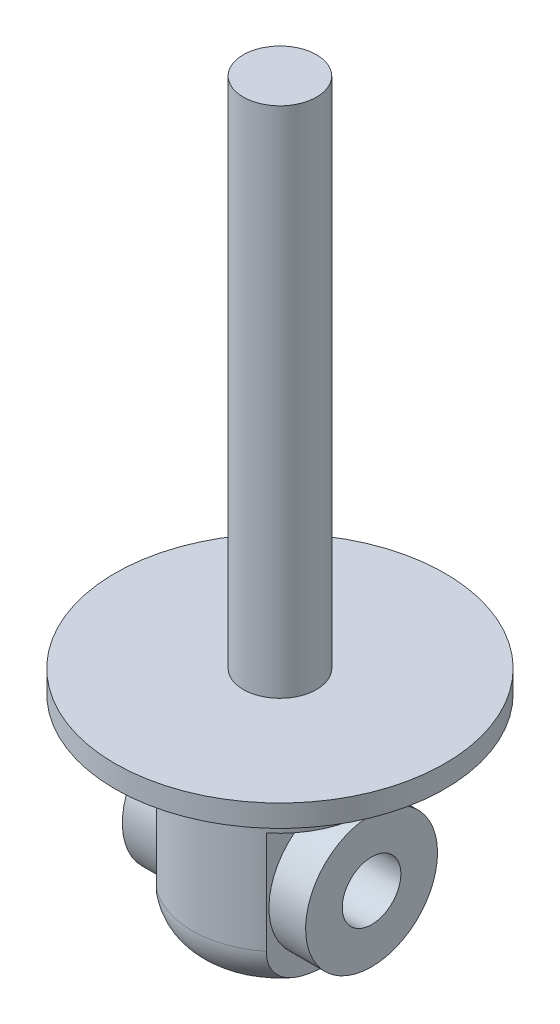
ISO-10303-21;
HEADER;
FILE_DESCRIPTION(('STEP AP214'),'2;1');
FILE_NAME('part.step','',(''),(''),'','','');
FILE_SCHEMA(('AUTOMOTIVE_DESIGN { 1 0 10303 214 1 1 1 1 }'));
ENDSEC;
DATA;
#1=APPLICATION_CONTEXT('core data for automotive mechanical design processes');
#2=APPLICATION_PROTOCOL_DEFINITION('international standard','automotive_design',2000,#1);
#3=PRODUCT_CONTEXT('',#1,'mechanical');
#4=PRODUCT('Part','Part','',(#3));
#5=PRODUCT_RELATED_PRODUCT_CATEGORY('part','',(#4));
#6=PRODUCT_DEFINITION_FORMATION('','',#4);
#7=PRODUCT_DEFINITION_CONTEXT('part definition',#1,'design');
#8=PRODUCT_DEFINITION('design','',#6,#7);
#9=PRODUCT_DEFINITION_SHAPE('','',#8);
#10=(LENGTH_UNIT() NAMED_UNIT(*) SI_UNIT(.MILLI.,.METRE.));
#11=(NAMED_UNIT(*) PLANE_ANGLE_UNIT() SI_UNIT($,.RADIAN.));
#12=(NAMED_UNIT(*) SI_UNIT($,.STERADIAN.) SOLID_ANGLE_UNIT());
#13=UNCERTAINTY_MEASURE_WITH_UNIT(LENGTH_MEASURE(1.E-05),#10,'distance_accuracy_value','');
#14=(GEOMETRIC_REPRESENTATION_CONTEXT(3) GLOBAL_UNCERTAINTY_ASSIGNED_CONTEXT((#13)) GLOBAL_UNIT_ASSIGNED_CONTEXT((#10,
#11,#12)) REPRESENTATION_CONTEXT('',''));
#15=CARTESIAN_POINT('',(0.,0.,0.));
#16=DIRECTION('',(0.,0.,1.));
#17=DIRECTION('',(1.,0.,0.));
#18=AXIS2_PLACEMENT_3D('',#15,#16,#17);
#19=CARTESIAN_POINT('',(-7.5,-8.,-14.));
#20=DIRECTION('',(1.,0.,0.));
#21=DIRECTION('',(0.,1.,0.));
#22=AXIS2_PLACEMENT_3D('',#19,#20,#21);
#23=PLANE('',#22);
#24=CARTESIAN_POINT('',(-7.5,-27.8094750193111,0.));
#25=CARTESIAN_POINT('',(-7.5,-27.8094752958151,0.184521628242419));
#26=CARTESIAN_POINT('',(-7.5,-27.8077270322999,0.369043480287191));
#27=CARTESIAN_POINT('',(-7.5,-27.8006130628877,0.737999394292284));
#28=CARTESIAN_POINT('',(-7.5,-27.7952477367066,0.922433463434384));
#29=CARTESIAN_POINT('',(-7.5,-27.780538513706,1.29122559425462));
#30=CARTESIAN_POINT('',(-7.5,-27.7711929215574,1.47558358999919));
#31=CARTESIAN_POINT('',(-7.5,-27.7479507640883,1.84401846668315));
#32=CARTESIAN_POINT('',(-7.5,-27.734054140347,2.02809534398339));
#33=CARTESIAN_POINT('',(-7.5,-27.701027325669,2.39498843631837));
#34=CARTESIAN_POINT('',(-7.5,-27.6819201299087,2.57780665418326));
#35=CARTESIAN_POINT('',(-7.5,-27.6375682217561,2.94269408038083));
#36=CARTESIAN_POINT('',(-7.5,-27.6123230495969,3.12476323156505));
#37=CARTESIAN_POINT('',(-7.5,-27.5259360262262,3.6691632505479));
#38=CARTESIAN_POINT('',(-7.5,-27.4541196223952,4.02997739530099));
#39=CARTESIAN_POINT('',(-7.5,-27.315114172541,4.57935988961709));
#40=CARTESIAN_POINT('',(-7.5,-27.2608348848703,4.77122256452969));
#41=CARTESIAN_POINT('',(-7.5,-27.1402411036094,5.15109529504942));
#42=CARTESIAN_POINT('',(-7.5,-27.0739312594077,5.33910680786539));
#43=CARTESIAN_POINT('',(-7.5,-26.928148698992,5.70992505463463));
#44=CARTESIAN_POINT('',(-7.5,-26.8486797977089,5.8927332791208));
#45=CARTESIAN_POINT('',(-7.5,-26.6756224712841,6.25155879665883));
#46=CARTESIAN_POINT('',(-7.5,-26.5820364486502,6.42757723883459));
#47=CARTESIAN_POINT('',(-7.5,-26.3958384208508,6.74413785402998));
#48=CARTESIAN_POINT('',(-7.5,-26.3053527427416,6.8859302136676));
#49=CARTESIAN_POINT('',(-7.5,-26.1136422044668,7.16205254122039));
#50=CARTESIAN_POINT('',(-7.5,-26.0124194056704,7.29638393401336));
#51=CARTESIAN_POINT('',(-7.5,-25.7991822855038,7.55627452274061));
#52=CARTESIAN_POINT('',(-7.5,-25.6871652583255,7.6818315054992));
#53=CARTESIAN_POINT('',(-7.5,-25.4525813942248,7.92270374400352));
#54=CARTESIAN_POINT('',(-7.5,-25.3300144777409,8.03801892249803));
#55=CARTESIAN_POINT('',(-7.5,-25.0736714823962,8.25792234562975));
#56=CARTESIAN_POINT('',(-7.5,-24.9398051473305,8.36240569865935));
#57=CARTESIAN_POINT('',(-7.5,-24.662616920615,8.55796576900282));
#58=CARTESIAN_POINT('',(-7.5,-24.5192963548439,8.64904436046083));
#59=CARTESIAN_POINT('',(-7.5,-24.2243409104845,8.81636481076627));
#60=CARTESIAN_POINT('',(-7.5,-24.0727112205184,8.89261579636784));
#61=CARTESIAN_POINT('',(-7.5,-23.7624095052739,9.02909243430965));
#62=CARTESIAN_POINT('',(-7.5,-23.6037388369551,9.08932115899454));
#63=CARTESIAN_POINT('',(-7.5,-23.3052245459151,9.1849514334904));
#64=CARTESIAN_POINT('',(-7.5,-23.1661361294911,9.22272405795734));
#65=CARTESIAN_POINT('',(-7.5,-22.8851087613884,9.28547940350164));
#66=CARTESIAN_POINT('',(-7.5,-22.7431701638949,9.31046370365637));
#67=CARTESIAN_POINT('',(-7.5,-22.4576599589478,9.34730641699016));
#68=CARTESIAN_POINT('',(-7.5,-22.3140890586128,9.35917031033292));
#69=CARTESIAN_POINT('',(-7.5,-22.0264648581988,9.36963164548865));
#70=CARTESIAN_POINT('',(-7.5,-21.8824115750842,9.36822954903948));
#71=CARTESIAN_POINT('',(-7.5,-21.6061914815275,9.35280339576898));
#72=CARTESIAN_POINT('',(-7.5,-21.4739684759154,9.33976569953801));
#73=CARTESIAN_POINT('',(-7.5,-21.2110534946456,9.30256363878721));
#74=CARTESIAN_POINT('',(-7.5,-21.0803620180608,9.27839574533066));
#75=CARTESIAN_POINT('',(-7.5,-20.8215410609612,9.21922065645586));
#76=CARTESIAN_POINT('',(-7.5,-20.6934101253726,9.18421981495561));
#77=CARTESIAN_POINT('',(-7.5,-20.4404340442512,9.10374552536161));
#78=CARTESIAN_POINT('',(-7.5,-20.3155901493276,9.05826815366643));
#79=CARTESIAN_POINT('',(-7.5,-20.0692031015505,8.9569956452057));
#80=CARTESIAN_POINT('',(-7.5,-19.9476868658852,8.90113499399756));
#81=CARTESIAN_POINT('',(-7.5,-19.7094920695403,8.77987692751897));
#82=CARTESIAN_POINT('',(-7.5,-19.5928152563103,8.71447610526943));
#83=CARTESIAN_POINT('',(-7.5,-19.2509911073174,8.50489875856372));
#84=CARTESIAN_POINT('',(-7.5,-19.0339195251877,8.34729299116935));
#85=CARTESIAN_POINT('',(-7.5,-18.609337427954,7.98870608163153));
#86=CARTESIAN_POINT('',(-7.5,-18.4039002281567,7.78529755950602));
#87=CARTESIAN_POINT('',(-7.5,-18.0246758733926,7.35109040646744));
#88=CARTESIAN_POINT('',(-7.5,-17.8508837047537,7.12029612399675));
#89=CARTESIAN_POINT('',(-7.5,-17.5744409595824,6.69864287979116));
#90=CARTESIAN_POINT('',(-7.5,-17.4648689537028,6.51223410047274));
#91=CARTESIAN_POINT('',(-7.5,-17.2626904112623,6.13034538679087));
#92=CARTESIAN_POINT('',(-7.5,-17.1700919878543,5.93486117014359));
#93=CARTESIAN_POINT('',(-7.5,-17.0006313082269,5.53658641063458));
#94=CARTESIAN_POINT('',(-7.5,-16.9238147555949,5.33377659321381));
#95=CARTESIAN_POINT('',(-7.5,-16.784875362625,4.92331428460811));
#96=CARTESIAN_POINT('',(-7.5,-16.7227484430634,4.71566315546475));
#97=CARTESIAN_POINT('',(-7.5,-16.5386673542946,4.02250667384637));
#98=CARTESIAN_POINT('',(-7.5,-16.4449803111871,3.52942656369883));
#99=CARTESIAN_POINT('',(-7.5,-16.3412352530644,2.78498720051468));
#100=CARTESIAN_POINT('',(-7.5,-16.3127705467372,2.53568557770052));
#101=CARTESIAN_POINT('',(-7.5,-16.2658269581612,2.03612434937441));
#102=CARTESIAN_POINT('',(-7.5,-16.2473468655649,1.78586486368144));
#103=CARTESIAN_POINT('',(-7.5,-16.2184283009414,1.28363112408655));
#104=CARTESIAN_POINT('',(-7.5,-16.208031590786,1.03165466176094));
#105=CARTESIAN_POINT('',(-7.5,-16.1941849220444,0.527501194688708));
#106=CARTESIAN_POINT('',(-7.5,-16.1907352988047,0.275324180848941));
#107=CARTESIAN_POINT('',(-7.5,-16.1903333462322,-0.228731345602944));
#108=CARTESIAN_POINT('',(-7.5,-16.193373232494,-0.480609853630142));
#109=CARTESIAN_POINT('',(-7.5,-16.2063332691715,-0.984173581494233));
#110=CARTESIAN_POINT('',(-7.5,-16.2162528039696,-1.2358588166087));
#111=CARTESIAN_POINT('',(-7.5,-16.2454935008677,-1.7627882566893));
#112=CARTESIAN_POINT('',(-7.5,-16.2656211327378,-2.03798990109168));
#113=CARTESIAN_POINT('',(-7.5,-16.3180418431017,-2.58731345976836));
#114=CARTESIAN_POINT('',(-7.5,-16.3503365349836,-2.86143522597441));
#115=CARTESIAN_POINT('',(-7.5,-16.4300545548583,-3.40623279358435));
#116=CARTESIAN_POINT('',(-7.5,-16.4774071358833,-3.67691867401872));
#117=CARTESIAN_POINT('',(-7.5,-16.5907053400646,-4.2143947607995));
#118=CARTESIAN_POINT('',(-7.5,-16.6566449229111,-4.48118620316469));
#119=CARTESIAN_POINT('',(-7.5,-16.7911834026755,-4.94217748017442));
#120=CARTESIAN_POINT('',(-7.5,-16.8549558474619,-5.13778160857807));
#121=CARTESIAN_POINT('',(-7.5,-16.9961265709521,-5.52399422741739));
#122=CARTESIAN_POINT('',(-7.5,-17.0735207892669,-5.71460418712136));
#123=CARTESIAN_POINT('',(-7.5,-17.2430793617625,-6.08921987221889));
#124=CARTESIAN_POINT('',(-7.5,-17.3352463319138,-6.27322442084438));
#125=CARTESIAN_POINT('',(-7.5,-17.5351759469553,-6.63256976145457));
#126=CARTESIAN_POINT('',(-7.5,-17.6429345063483,-6.80791280693597));
#127=CARTESIAN_POINT('',(-7.5,-17.8487615005736,-7.10989658300674));
#128=CARTESIAN_POINT('',(-7.5,-17.9436617626469,-7.23870103997639));
#129=CARTESIAN_POINT('',(-7.5,-18.143229826346,-7.48856622066219));
#130=CARTESIAN_POINT('',(-7.5,-18.2478987883735,-7.60962602152205));
#131=CARTESIAN_POINT('',(-7.5,-18.4668045949393,-7.84271387792474));
#132=CARTESIAN_POINT('',(-7.5,-18.5810384459287,-7.95474473789612));
#133=CARTESIAN_POINT('',(-7.5,-18.8187268203134,-8.16854933672494));
#134=CARTESIAN_POINT('',(-7.5,-18.9421800591116,-8.27032449994956));
#135=CARTESIAN_POINT('',(-7.5,-19.1987356397018,-8.46313596223061));
#136=CARTESIAN_POINT('',(-7.5,-19.3319055781875,-8.55408255407202));
#137=CARTESIAN_POINT('',(-7.5,-19.6061418402457,-8.72304401015933));
#138=CARTESIAN_POINT('',(-7.5,-19.747204378254,-8.80106500403696));
#139=CARTESIAN_POINT('',(-7.5,-20.0362068877473,-8.94309470867639));
#140=CARTESIAN_POINT('',(-7.5,-20.1841460034049,-9.00710515749598));
#141=CARTESIAN_POINT('',(-7.5,-20.4856380297523,-9.12014361193693));
#142=CARTESIAN_POINT('',(-7.5,-20.6391901444676,-9.16917373274798));
#143=CARTESIAN_POINT('',(-7.5,-20.9313639562727,-9.24643392787081));
#144=CARTESIAN_POINT('',(-7.5,-21.0695088202567,-9.27647685632879));
#145=CARTESIAN_POINT('',(-7.5,-21.3479315795213,-9.32406143536891));
#146=CARTESIAN_POINT('',(-7.5,-21.4882092809526,-9.34160421520928));
#147=CARTESIAN_POINT('',(-7.5,-21.769719609589,-9.36396002322679));
#148=CARTESIAN_POINT('',(-7.5,-21.9109518422674,-9.36877802253041));
#149=CARTESIAN_POINT('',(-7.5,-22.1932734390957,-9.36563613906261));
#150=CARTESIAN_POINT('',(-7.5,-22.3343628067459,-9.35767657732182));
#151=CARTESIAN_POINT('',(-7.5,-22.6064011749062,-9.32998563551063));
#152=CARTESIAN_POINT('',(-7.5,-22.7374295539783,-9.31102660205279));
#153=CARTESIAN_POINT('',(-7.5,-22.9974780227225,-9.26218788836622));
#154=CARTESIAN_POINT('',(-7.5,-23.1264974548056,-9.23230470755187));
#155=CARTESIAN_POINT('',(-7.5,-23.3815508516768,-9.16196479385525));
#156=CARTESIAN_POINT('',(-7.5,-23.5075862018083,-9.12151307666088));
#157=CARTESIAN_POINT('',(-7.5,-23.7559772755244,-9.03044888037393));
#158=CARTESIAN_POINT('',(-7.5,-23.8783315975104,-8.97983258590814));
#159=CARTESIAN_POINT('',(-7.5,-24.1205569584555,-8.8680617574251));
#160=CARTESIAN_POINT('',(-7.5,-24.2403549182387,-8.80674877020291));
#161=CARTESIAN_POINT('',(-7.5,-24.4747211723639,-8.67480187441993));
#162=CARTESIAN_POINT('',(-7.5,-24.5892875713423,-8.60416462323317));
#163=CARTESIAN_POINT('',(-7.49999999999999,-24.9242270275788,-8.37928997825773));
#164=CARTESIAN_POINT('',(-7.5,-25.13600210755,-8.21201407264852));
#165=CARTESIAN_POINT('',(-7.5,-25.5504485361803,-7.83294273917801));
#166=CARTESIAN_POINT('',(-7.5,-25.7507010772538,-7.618532285847));
#167=CARTESIAN_POINT('',(-7.5,-26.1185076671662,-7.16337882817299));
#168=CARTESIAN_POINT('',(-7.5,-26.2860513710234,-6.9226275303298));
#169=CARTESIAN_POINT('',(-7.5,-26.5545024709803,-6.4788664395953));
#170=CARTESIAN_POINT('',(-7.5,-26.6619013252763,-6.279707295078));
#171=CARTESIAN_POINT('',(-7.5,-26.858559219587,-5.87254463104013));
#172=CARTESIAN_POINT('',(-7.5,-26.9478095430477,-5.66453691936401));
#173=CARTESIAN_POINT('',(-7.5,-27.1096214973705,-5.24180758530233));
#174=CARTESIAN_POINT('',(-7.5,-27.1821555960046,-5.02707553901332));
#175=CARTESIAN_POINT('',(-7.5,-27.3121001369762,-4.59305326757356));
#176=CARTESIAN_POINT('',(-7.5,-27.3695048137837,-4.37376133898657));
#177=CARTESIAN_POINT('',(-7.5,-27.4981886749365,-3.81417726059937));
#178=CARTESIAN_POINT('',(-7.5,-27.5604951716191,-3.4718329690517));
#179=CARTESIAN_POINT('',(-7.5,-27.6609019684328,-2.7835920061487));
#180=CARTESIAN_POINT('',(-7.5,-27.6989863972919,-2.43769315620305));
#181=CARTESIAN_POINT('',(-7.5,-27.7425563308733,-1.91723181279188));
#182=CARTESIAN_POINT('',(-7.5,-27.7548291128016,-1.74318957751326));
#183=CARTESIAN_POINT('',(-7.5,-27.7753986995787,-1.39487161182967));
#184=CARTESIAN_POINT('',(-7.5,-27.7836956019396,-1.22059588725638));
#185=CARTESIAN_POINT('',(-7.5,-27.796777523185,-0.87196539298604));
#186=CARTESIAN_POINT('',(-7.5,-27.8015635129394,-0.697610658492171));
#187=CARTESIAN_POINT('',(-7.5,-27.8079121855994,-0.348837350643893));
#188=CARTESIAN_POINT('',(-7.5,-27.8094747579462,-0.174418775305038));
#189=CARTESIAN_POINT('',(-7.5,-27.8094750193111,0.));
#190=B_SPLINE_CURVE_WITH_KNOTS('',3,(#24,#25,#26,#27,#28,#29,#30,#31,#32,#33,#34,#35,#36,#37,
#38,#39,#40,#41,#42,#43,#44,#45,#46,#47,#48,#49,#50,#51,#52,#53,#54,#55,#56,#57,#58,#59,#60,#61,
#62,#63,#64,#65,#66,#67,#68,#69,#70,#71,#72,#73,#74,#75,#76,#77,#78,#79,#80,#81,#82,#83,#84,#85,
#86,#87,#88,#89,#90,#91,#92,#93,#94,#95,#96,#97,#98,#99,#100,#101,#102,#103,#104,#105,#106,#107,
#108,#109,#110,#111,#112,#113,#114,#115,#116,#117,#118,#119,#120,#121,#122,#123,#124,#125,#126,
#127,#128,#129,#130,#131,#132,#133,#134,#135,#136,#137,#138,#139,#140,#141,#142,#143,#144,#145,
#146,#147,#148,#149,#150,#151,#152,#153,#154,#155,#156,#157,#158,#159,#160,#161,#162,#163,#164,
#165,#166,#167,#168,#169,#170,#171,#172,#173,#174,#175,#176,#177,#178,#179,#180,#181,#182,#183,
#184,#185,#186,#187,#188,#189),.UNSPECIFIED.,.T.,.F.,(4,2,2,2,2,2,2,2,2,2,2,2,2,2,2,2,2,2,2,2,2,
2,2,2,2,2,2,2,2,2,2,2,2,2,2,2,2,2,2,2,2,2,2,2,2,2,2,2,2,2,2,2,2,2,2,2,2,2,2,2,2,2,2,2,2,2,2,2,2,
2,2,2,2,2,2,2,2,2,2,2,2,2,4),(0.,0.553556541747908,1.10705498067111,1.6607894093517,
2.21453094651203,2.76586720349669,3.31724477121585,4.41912680182767,5.01698525599297,
5.61461314908642,6.21206808675634,6.80942146164093,7.31357153503217,7.81762499361292,
8.32180513447662,8.82598907791493,9.33467160980089,9.84328295415677,10.3515802378956,
10.8597799828438,11.291588037567,11.7233427606026,12.1549170790764,12.5864763761706,
12.9845986570771,13.3828472534997,13.7808627038906,14.1790274594522,14.579795450788,
14.9807069160888,15.7821103743006,16.6461503316802,17.5100532757815,18.1578732554314,
18.8060020817716,19.4559821948789,20.1057815998326,21.6069748462105,22.3596793389022,
23.1122925673176,23.8687687149109,24.6252813779039,25.3808870860738,26.1364251884592,
26.9640249034878,27.7917343993232,28.6156111127982,29.4392203950451,30.0559954213971,
30.6725869093733,31.2892877047367,31.9058271963483,32.3853559200308,32.8649416785199,
33.3443778968313,33.823747436381,34.3068464150843,34.7897156366604,35.2725249226046,
35.7552660053908,36.1788379642465,36.6023716529343,37.0257398573389,37.4490974249689,
37.8458122806135,38.2426543730445,38.639308470493,39.0361117351622,39.4393886143668,
39.8428104576492,40.6491243408277,41.5260051520067,42.403162850804,43.0810551134699,
43.7592721958252,44.4385984678267,45.1181832448308,46.1608437011148,47.2041866484774,
47.7275747628343,48.2509500399341,48.7741805338585,49.2974289735857),.UNSPECIFIED.);
#191=CARTESIAN_POINT('',(-7.5,-22.,-9.3674969975976));
#192=VERTEX_POINT('',#191);
#193=CARTESIAN_POINT('',(-7.5,-21.9999999999999,9.36749699759766));
#194=VERTEX_POINT('',#193);
#195=EDGE_CURVE('E126',#192,#194,#190,.T.);
#196=ORIENTED_EDGE('',*,*,#195,.T.);
#197=DIRECTION('',(0.,1.,0.));
#198=VECTOR('',#197,1.);
#199=CARTESIAN_POINT('',(-7.5,-28.,9.36749699759761));
#200=LINE('',#199,#198);
#201=CARTESIAN_POINT('',(-7.5,-8.,9.3674969975976));
#202=VERTEX_POINT('',#201);
#203=EDGE_CURVE('E152',#202,#194,#200,.F.);
#204=ORIENTED_EDGE('',*,*,#203,.F.);
#205=DIRECTION('',(0.,0.,1.));
#206=VECTOR('',#205,1.);
#207=CARTESIAN_POINT('',(-7.5,-8.,-14.));
#208=LINE('',#207,#206);
#209=CARTESIAN_POINT('',(-7.5,-8.,-9.36749699759761));
#210=VERTEX_POINT('',#209);
#211=EDGE_CURVE('E155',#210,#202,#208,.T.);
#212=ORIENTED_EDGE('',*,*,#211,.F.);
#213=DIRECTION('',(0.,1.,0.));
#214=VECTOR('',#213,1.);
#215=CARTESIAN_POINT('',(-7.5,-28.,-9.36749699759761));
#216=LINE('',#215,#214);
#217=EDGE_CURVE('E148',#192,#210,#216,.T.);
#218=ORIENTED_EDGE('',*,*,#217,.F.);
#219=EDGE_LOOP('',(#196,#204,#212,#218));
#220=FACE_BOUND('',#219,.T.);
#221=CARTESIAN_POINT('',(-7.5,-17.022669539337,0.));
#222=DIRECTION('',(1.,0.,0.));
#223=DIRECTION('',(0.,1.,0.));
#224=AXIS2_PLACEMENT_3D('',#221,#222,#223);
#225=CIRCLE('',#224,9.);
#226=CARTESIAN_POINT('',(-7.5,-8.02266953933701,0.));
#227=VERTEX_POINT('',#226);
#228=EDGE_CURVE('E11',#227,#227,#225,.F.);
#229=ORIENTED_EDGE('',*,*,#228,.F.);
#230=EDGE_LOOP('',(#229));
#231=FACE_BOUND('',#230,.T.);
#232=ADVANCED_FACE('F39',(#220,#231),#23,.F.);
#233=CARTESIAN_POINT('',(7.5,-8.,-14.));
#234=DIRECTION('',(-1.,0.,0.));
#235=DIRECTION('',(0.,-1.,0.));
#236=AXIS2_PLACEMENT_3D('',#233,#234,#235);
#237=PLANE('',#236);
#238=CARTESIAN_POINT('',(7.5,-27.8094750193111,0.));
#239=CARTESIAN_POINT('',(7.5,-27.8094752958151,-0.18452162824242));
#240=CARTESIAN_POINT('',(7.5,-27.8077270322999,-0.369043480287192));
#241=CARTESIAN_POINT('',(7.5,-27.8006130628877,-0.737999394292285));
#242=CARTESIAN_POINT('',(7.5,-27.7952477367066,-0.922433463434386));
#243=CARTESIAN_POINT('',(7.5,-27.780538513706,-1.29122559425462));
#244=CARTESIAN_POINT('',(7.5,-27.7711929215574,-1.47558358999919));
#245=CARTESIAN_POINT('',(7.5,-27.7479507640883,-1.84401846668315));
#246=CARTESIAN_POINT('',(7.5,-27.734054140347,-2.0280953439834));
#247=CARTESIAN_POINT('',(7.5,-27.701027325669,-2.39498843631837));
#248=CARTESIAN_POINT('',(7.5,-27.6819201299087,-2.57780665418327));
#249=CARTESIAN_POINT('',(7.5,-27.6375682217561,-2.94269408038084));
#250=CARTESIAN_POINT('',(7.5,-27.6123230495969,-3.12476323156505));
#251=CARTESIAN_POINT('',(7.5,-27.5259360262262,-3.6691632505479));
#252=CARTESIAN_POINT('',(7.5,-27.4541196223952,-4.02997739530099));
#253=CARTESIAN_POINT('',(7.5,-27.315114172541,-4.57935988961709));
#254=CARTESIAN_POINT('',(7.5,-27.2608348848703,-4.7712225645297));
#255=CARTESIAN_POINT('',(7.5,-27.1402411036094,-5.15109529504943));
#256=CARTESIAN_POINT('',(7.5,-27.0739312594077,-5.3391068078654));
#257=CARTESIAN_POINT('',(7.5,-26.9281486989919,-5.70992505463464));
#258=CARTESIAN_POINT('',(7.5,-26.8486797977089,-5.8927332791208));
#259=CARTESIAN_POINT('',(7.5,-26.6756224712841,-6.25155879665884));
#260=CARTESIAN_POINT('',(7.5,-26.5820364486501,-6.4275772388346));
#261=CARTESIAN_POINT('',(7.5,-26.3958384208508,-6.74413785402998));
#262=CARTESIAN_POINT('',(7.5,-26.3053527427416,-6.8859302136676));
#263=CARTESIAN_POINT('',(7.5,-26.1136422044668,-7.16205254122039));
#264=CARTESIAN_POINT('',(7.5,-26.0124194056704,-7.29638393401337));
#265=CARTESIAN_POINT('',(7.5,-25.7991822855038,-7.55627452274061));
#266=CARTESIAN_POINT('',(7.5,-25.6871652583255,-7.6818315054992));
#267=CARTESIAN_POINT('',(7.5,-25.4525813942248,-7.92270374400352));
#268=CARTESIAN_POINT('',(7.5,-25.3300144777409,-8.03801892249803));
#269=CARTESIAN_POINT('',(7.5,-25.0736714823962,-8.25792234562975));
#270=CARTESIAN_POINT('',(7.5,-24.9398051473305,-8.36240569865935));
#271=CARTESIAN_POINT('',(7.5,-24.662616920615,-8.55796576900282));
#272=CARTESIAN_POINT('',(7.5,-24.5192963548439,-8.64904436046083));
#273=CARTESIAN_POINT('',(7.5,-24.2243409104845,-8.81636481076627));
#274=CARTESIAN_POINT('',(7.5,-24.0727112205184,-8.89261579636783));
#275=CARTESIAN_POINT('',(7.5,-23.7624095052739,-9.02909243430965));
#276=CARTESIAN_POINT('',(7.5,-23.6037388369551,-9.08932115899453));
#277=CARTESIAN_POINT('',(7.5,-23.3052245459151,-9.1849514334904));
#278=CARTESIAN_POINT('',(7.5,-23.166136129491,-9.22272405795733));
#279=CARTESIAN_POINT('',(7.5,-22.8851087613884,-9.28547940350164));
#280=CARTESIAN_POINT('',(7.5,-22.7431701638949,-9.31046370365637));
#281=CARTESIAN_POINT('',(7.5,-22.4576599589478,-9.34730641699015));
#282=CARTESIAN_POINT('',(7.5,-22.3140890586128,-9.35917031033292));
#283=CARTESIAN_POINT('',(7.5,-22.0264648581988,-9.36963164548865));
#284=CARTESIAN_POINT('',(7.5,-21.8824115750842,-9.36822954903947));
#285=CARTESIAN_POINT('',(7.5,-21.6061914815275,-9.35280339576898));
#286=CARTESIAN_POINT('',(7.5,-21.4739684759153,-9.33976569953801));
#287=CARTESIAN_POINT('',(7.5,-21.2110534946456,-9.3025636387872));
#288=CARTESIAN_POINT('',(7.5,-21.0803620180608,-9.27839574533065));
#289=CARTESIAN_POINT('',(7.5,-20.8215410609612,-9.21922065645586));
#290=CARTESIAN_POINT('',(7.5,-20.6934101253726,-9.1842198149556));
#291=CARTESIAN_POINT('',(7.5,-20.4404340442512,-9.1037455253616));
#292=CARTESIAN_POINT('',(7.5,-20.3155901493276,-9.05826815366643));
#293=CARTESIAN_POINT('',(7.5,-20.0692031015505,-8.95699564520569));
#294=CARTESIAN_POINT('',(7.5,-19.9476868658852,-8.90113499399755));
#295=CARTESIAN_POINT('',(7.5,-19.7094920695403,-8.77987692751896));
#296=CARTESIAN_POINT('',(7.5,-19.5928152563103,-8.71447610526942));
#297=CARTESIAN_POINT('',(7.5,-19.2509911073174,-8.50489875856371));
#298=CARTESIAN_POINT('',(7.5,-19.0339195251877,-8.34729299116934));
#299=CARTESIAN_POINT('',(7.5,-18.609337427954,-7.98870608163152));
#300=CARTESIAN_POINT('',(7.5,-18.4039002281567,-7.78529755950601));
#301=CARTESIAN_POINT('',(7.5,-18.0246758733926,-7.35109040646742));
#302=CARTESIAN_POINT('',(7.5,-17.8508837047537,-7.12029612399674));
#303=CARTESIAN_POINT('',(7.5,-17.5744409595824,-6.69864287979115));
#304=CARTESIAN_POINT('',(7.5,-17.4648689537028,-6.51223410047273));
#305=CARTESIAN_POINT('',(7.5,-17.2626904112623,-6.13034538679085));
#306=CARTESIAN_POINT('',(7.5,-17.1700919878543,-5.93486117014358));
#307=CARTESIAN_POINT('',(7.5,-17.0006313082269,-5.53658641063457));
#308=CARTESIAN_POINT('',(7.5,-16.9238147555949,-5.3337765932138));
#309=CARTESIAN_POINT('',(7.5,-16.784875362625,-4.92331428460809));
#310=CARTESIAN_POINT('',(7.5,-16.7227484430634,-4.71566315546473));
#311=CARTESIAN_POINT('',(7.5,-16.5386673542946,-4.02250667384634));
#312=CARTESIAN_POINT('',(7.5,-16.4449803111871,-3.52942656369881));
#313=CARTESIAN_POINT('',(7.5,-16.3412352530644,-2.78498720051465));
#314=CARTESIAN_POINT('',(7.5,-16.3127705467372,-2.53568557770049));
#315=CARTESIAN_POINT('',(7.5,-16.2658269581612,-2.03612434937437));
#316=CARTESIAN_POINT('',(7.5,-16.2473468655649,-1.78586486368141));
#317=CARTESIAN_POINT('',(7.5,-16.2184283009414,-1.28363112408651));
#318=CARTESIAN_POINT('',(7.5,-16.208031590786,-1.0316546617609));
#319=CARTESIAN_POINT('',(7.5,-16.1941849220444,-0.527501194688668));
#320=CARTESIAN_POINT('',(7.5,-16.1907352988047,-0.2753241808489));
#321=CARTESIAN_POINT('',(7.5,-16.1903333462322,0.228731345602987));
#322=CARTESIAN_POINT('',(7.5,-16.193373232494,0.480609853630186));
#323=CARTESIAN_POINT('',(7.5,-16.2063332691715,0.984173581494279));
#324=CARTESIAN_POINT('',(7.5,-16.2162528039696,1.23585881660875));
#325=CARTESIAN_POINT('',(7.5,-16.2454935008677,1.76278825668935));
#326=CARTESIAN_POINT('',(7.5,-16.2656211327378,2.03798990109172));
#327=CARTESIAN_POINT('',(7.5,-16.3180418431018,2.5873134597684));
#328=CARTESIAN_POINT('',(7.5,-16.3503365349836,2.86143522597445));
#329=CARTESIAN_POINT('',(7.5,-16.4300545548583,3.40623279358438));
#330=CARTESIAN_POINT('',(7.5,-16.4774071358833,3.67691867401874));
#331=CARTESIAN_POINT('',(7.5,-16.5907053400646,4.21439476079952));
#332=CARTESIAN_POINT('',(7.5,-16.6566449229111,4.48118620316471));
#333=CARTESIAN_POINT('',(7.5,-16.7911834026755,4.94217748017443));
#334=CARTESIAN_POINT('',(7.5,-16.8549558474619,5.13778160857808));
#335=CARTESIAN_POINT('',(7.5,-16.9961265709521,5.5239942274174));
#336=CARTESIAN_POINT('',(7.5,-17.073520789267,5.71460418712137));
#337=CARTESIAN_POINT('',(7.5,-17.2430793617625,6.0892198722189));
#338=CARTESIAN_POINT('',(7.5,-17.3352463319138,6.27322442084439));
#339=CARTESIAN_POINT('',(7.5,-17.5351759469553,6.63256976145458));
#340=CARTESIAN_POINT('',(7.5,-17.6429345063483,6.80791280693598));
#341=CARTESIAN_POINT('',(7.5,-17.8487615005737,7.10989658300674));
#342=CARTESIAN_POINT('',(7.5,-17.9436617626469,7.2387010399764));
#343=CARTESIAN_POINT('',(7.5,-18.143229826346,7.48856622066219));
#344=CARTESIAN_POINT('',(7.5,-18.2478987883735,7.60962602152205));
#345=CARTESIAN_POINT('',(7.5,-18.4668045949393,7.84271387792474));
#346=CARTESIAN_POINT('',(7.5,-18.5810384459287,7.95474473789612));
#347=CARTESIAN_POINT('',(7.5,-18.8187268203134,8.16854933672495));
#348=CARTESIAN_POINT('',(7.5,-18.9421800591116,8.27032449994957));
#349=CARTESIAN_POINT('',(7.5,-19.1987356397018,8.46313596223061));
#350=CARTESIAN_POINT('',(7.5,-19.3319055781875,8.55408255407203));
#351=CARTESIAN_POINT('',(7.5,-19.6061418402457,8.72304401015934));
#352=CARTESIAN_POINT('',(7.5,-19.747204378254,8.80106500403696));
#353=CARTESIAN_POINT('',(7.5,-20.0362068877473,8.94309470867639));
#354=CARTESIAN_POINT('',(7.5,-20.1841460034049,9.00710515749598));
#355=CARTESIAN_POINT('',(7.5,-20.4856380297523,9.12014361193693));
#356=CARTESIAN_POINT('',(7.5,-20.6391901444676,9.16917373274798));
#357=CARTESIAN_POINT('',(7.5,-20.9313639562727,9.24643392787081));
#358=CARTESIAN_POINT('',(7.5,-21.0695088202567,9.27647685632879));
#359=CARTESIAN_POINT('',(7.5,-21.3479315795213,9.32406143536891));
#360=CARTESIAN_POINT('',(7.5,-21.4882092809526,9.34160421520928));
#361=CARTESIAN_POINT('',(7.5,-21.769719609589,9.36396002322678));
#362=CARTESIAN_POINT('',(7.5,-21.9109518422674,9.36877802253041));
#363=CARTESIAN_POINT('',(7.5,-22.1932734390957,9.36563613906261));
#364=CARTESIAN_POINT('',(7.5,-22.3343628067459,9.35767657732182));
#365=CARTESIAN_POINT('',(7.5,-22.6064011749062,9.32998563551062));
#366=CARTESIAN_POINT('',(7.5,-22.7374295539783,9.31102660205278));
#367=CARTESIAN_POINT('',(7.5,-22.9974780227225,9.26218788836622));
#368=CARTESIAN_POINT('',(7.5,-23.1264974548056,9.23230470755187));
#369=CARTESIAN_POINT('',(7.5,-23.3815508516768,9.16196479385525));
#370=CARTESIAN_POINT('',(7.5,-23.5075862018083,9.12151307666088));
#371=CARTESIAN_POINT('',(7.5,-23.7559772755244,9.03044888037393));
#372=CARTESIAN_POINT('',(7.5,-23.8783315975104,8.97983258590813));
#373=CARTESIAN_POINT('',(7.5,-24.1205569584555,8.86806175742509));
#374=CARTESIAN_POINT('',(7.5,-24.2403549182387,8.8067487702029));
#375=CARTESIAN_POINT('',(7.5,-24.4747211723639,8.67480187441993));
#376=CARTESIAN_POINT('',(7.5,-24.5892875713423,8.60416462323317));
#377=CARTESIAN_POINT('',(7.5,-24.9242270275788,8.37928997825773));
#378=CARTESIAN_POINT('',(7.5,-25.13600210755,8.21201407264852));
#379=CARTESIAN_POINT('',(7.5,-25.5504485361803,7.832942739178));
#380=CARTESIAN_POINT('',(7.5,-25.7507010772538,7.61853228584699));
#381=CARTESIAN_POINT('',(7.5,-26.1185076671662,7.16337882817298));
#382=CARTESIAN_POINT('',(7.5,-26.2860513710234,6.92262753032979));
#383=CARTESIAN_POINT('',(7.5,-26.5545024709803,6.4788664395953));
#384=CARTESIAN_POINT('',(7.5,-26.6619013252763,6.27970729507799));
#385=CARTESIAN_POINT('',(7.5,-26.858559219587,5.87254463104012));
#386=CARTESIAN_POINT('',(7.5,-26.9478095430477,5.664536919364));
#387=CARTESIAN_POINT('',(7.5,-27.1096214973705,5.24180758530232));
#388=CARTESIAN_POINT('',(7.5,-27.1821555960046,5.02707553901331));
#389=CARTESIAN_POINT('',(7.5,-27.3121001369762,4.59305326757355));
#390=CARTESIAN_POINT('',(7.5,-27.3695048137837,4.37376133898656));
#391=CARTESIAN_POINT('',(7.5,-27.4981886749365,3.81417726059936));
#392=CARTESIAN_POINT('',(7.5,-27.5604951716191,3.47183296905169));
#393=CARTESIAN_POINT('',(7.5,-27.6609019684328,2.78359200614869));
#394=CARTESIAN_POINT('',(7.5,-27.6989863972919,2.43769315620304));
#395=CARTESIAN_POINT('',(7.5,-27.7425563308733,1.91723181279187));
#396=CARTESIAN_POINT('',(7.5,-27.7548291128016,1.74318957751326));
#397=CARTESIAN_POINT('',(7.5,-27.7753986995787,1.39487161182966));
#398=CARTESIAN_POINT('',(7.5,-27.7836956019396,1.22059588725637));
#399=CARTESIAN_POINT('',(7.5,-27.796777523185,0.871965392986033));
#400=CARTESIAN_POINT('',(7.5,-27.8015635129394,0.697610658492164));
#401=CARTESIAN_POINT('',(7.5,-27.8079121855994,0.348837350643888));
#402=CARTESIAN_POINT('',(7.5,-27.8094747579462,0.174418775305036));
#403=CARTESIAN_POINT('',(7.5,-27.8094750193111,0.));
#404=B_SPLINE_CURVE_WITH_KNOTS('',3,(#238,#239,#240,#241,#242,#243,#244,#245,#246,#247,#248,
#249,#250,#251,#252,#253,#254,#255,#256,#257,#258,#259,#260,#261,#262,#263,#264,#265,#266,#267,
#268,#269,#270,#271,#272,#273,#274,#275,#276,#277,#278,#279,#280,#281,#282,#283,#284,#285,#286,
#287,#288,#289,#290,#291,#292,#293,#294,#295,#296,#297,#298,#299,#300,#301,#302,#303,#304,#305,
#306,#307,#308,#309,#310,#311,#312,#313,#314,#315,#316,#317,#318,#319,#320,#321,#322,#323,#324,
#325,#326,#327,#328,#329,#330,#331,#332,#333,#334,#335,#336,#337,#338,#339,#340,#341,#342,#343,
#344,#345,#346,#347,#348,#349,#350,#351,#352,#353,#354,#355,#356,#357,#358,#359,#360,#361,#362,
#363,#364,#365,#366,#367,#368,#369,#370,#371,#372,#373,#374,#375,#376,#377,#378,#379,#380,#381,
#382,#383,#384,#385,#386,#387,#388,#389,#390,#391,#392,#393,#394,#395,#396,#397,#398,#399,#400,
#401,#402,#403),.UNSPECIFIED.,.T.,.F.,(4,2,2,2,2,2,2,2,2,2,2,2,2,2,2,2,2,2,2,2,2,2,2,2,2,2,2,2,
2,2,2,2,2,2,2,2,2,2,2,2,2,2,2,2,2,2,2,2,2,2,2,2,2,2,2,2,2,2,2,2,2,2,2,2,2,2,2,2,2,2,2,2,2,2,2,2,
2,2,2,2,2,2,4),(0.,0.553556541747909,1.10705498067111,1.66078940935171,2.21453094651203,
2.7658672034967,3.31724477121585,4.41912680182767,5.01698525599297,5.61461314908643,
6.21206808675635,6.80942146164093,7.31357153503217,7.81762499361292,8.32180513447662,
8.82598907791494,9.33467160980088,9.84328295415677,10.3515802378956,10.8597799828438,
11.291588037567,11.7233427606026,12.1549170790764,12.5864763761706,12.9845986570771,
13.3828472534997,13.7808627038906,14.1790274594522,14.579795450788,14.9807069160888,
15.7821103743006,16.6461503316802,17.5100532757815,18.1578732554314,18.8060020817716,
19.4559821948789,20.1057815998326,21.6069748462106,22.3596793389022,23.1122925673176,
23.8687687149109,24.6252813779039,25.3808870860739,26.1364251884592,26.9640249034878,
27.7917343993232,28.6156111127982,29.4392203950451,30.0559954213971,30.6725869093732,
31.2892877047367,31.9058271963483,32.3853559200308,32.8649416785199,33.3443778968313,
33.823747436381,34.3068464150843,34.7897156366604,35.2725249226045,35.7552660053908,
36.1788379642465,36.6023716529343,37.0257398573389,37.4490974249689,37.8458122806135,
38.2426543730445,38.639308470493,39.0361117351622,39.4393886143668,39.8428104576491,
40.6491243408277,41.5260051520067,42.4031628508039,43.0810551134699,43.7592721958252,
44.4385984678267,45.1181832448308,46.1608437011148,47.2041866484774,47.7275747628343,
48.2509500399341,48.7741805338585,49.2974289735857),.UNSPECIFIED.);
#405=CARTESIAN_POINT('',(7.5,-22.,9.3674969975976));
#406=VERTEX_POINT('',#405);
#407=CARTESIAN_POINT('',(7.5,-21.9999999999999,-9.36749699759765));
#408=VERTEX_POINT('',#407);
#409=EDGE_CURVE('E87',#406,#408,#404,.T.);
#410=ORIENTED_EDGE('',*,*,#409,.T.);
#411=DIRECTION('',(0.,1.,0.));
#412=VECTOR('',#411,1.);
#413=CARTESIAN_POINT('',(7.5,-28.,-9.3674969975976));
#414=LINE('',#413,#412);
#415=CARTESIAN_POINT('',(7.5,-8.,-9.3674969975976));
#416=VERTEX_POINT('',#415);
#417=EDGE_CURVE('E82',#416,#408,#414,.F.);
#418=ORIENTED_EDGE('',*,*,#417,.F.);
#419=DIRECTION('',(0.,0.,1.));
#420=VECTOR('',#419,1.);
#421=CARTESIAN_POINT('',(7.5,-8.,-14.));
#422=LINE('',#421,#420);
#423=CARTESIAN_POINT('',(7.5,-8.,9.3674969975976));
#424=VERTEX_POINT('',#423);
#425=EDGE_CURVE('E86',#416,#424,#422,.T.);
#426=ORIENTED_EDGE('',*,*,#425,.T.);
#427=DIRECTION('',(0.,1.,0.));
#428=VECTOR('',#427,1.);
#429=CARTESIAN_POINT('',(7.5,-28.,9.3674969975976));
#430=LINE('',#429,#428);
#431=EDGE_CURVE('E56',#406,#424,#430,.T.);
#432=ORIENTED_EDGE('',*,*,#431,.F.);
#433=EDGE_LOOP('',(#410,#418,#426,#432));
#434=FACE_BOUND('',#433,.T.);
#435=CARTESIAN_POINT('',(7.5,-17.022669539337,0.));
#436=DIRECTION('',(-1.,0.,0.));
#437=DIRECTION('',(0.,-1.,0.));
#438=AXIS2_PLACEMENT_3D('',#435,#436,#437);
#439=CIRCLE('',#438,9.);
#440=CARTESIAN_POINT('',(7.5,-26.022669539337,0.));
#441=VERTEX_POINT('',#440);
#442=EDGE_CURVE('E44',#441,#441,#439,.F.);
#443=ORIENTED_EDGE('',*,*,#442,.F.);
#444=EDGE_LOOP('',(#443));
#445=FACE_BOUND('',#444,.T.);
#446=ADVANCED_FACE('F84',(#434,#445),#237,.F.);
#447=CARTESIAN_POINT('',(0.,0.,0.));
#448=DIRECTION('',(0.,1.,0.));
#449=DIRECTION('',(0.,0.,1.));
#450=AXIS2_PLACEMENT_3D('',#447,#448,#449);
#451=PLANE('',#450);
#452=CARTESIAN_POINT('',(0.,0.,0.));
#453=DIRECTION('',(0.,1.,0.));
#454=DIRECTION('',(0.,0.,1.));
#455=AXIS2_PLACEMENT_3D('',#452,#453,#454);
#456=CIRCLE('',#455,22.5);
#457=CARTESIAN_POINT('',(0.,0.,22.5));
#458=VERTEX_POINT('',#457);
#459=EDGE_CURVE('E139',#458,#458,#456,.T.);
#460=ORIENTED_EDGE('',*,*,#459,.F.);
#461=EDGE_LOOP('',(#460));
#462=FACE_BOUND('',#461,.T.);
#463=CARTESIAN_POINT('',(0.,0.,0.));
#464=DIRECTION('',(0.,1.,0.));
#465=DIRECTION('',(0.,0.,1.));
#466=AXIS2_PLACEMENT_3D('',#463,#464,#465);
#467=CIRCLE('',#466,12.);
#468=CARTESIAN_POINT('',(0.,0.,12.));
#469=VERTEX_POINT('',#468);
#470=EDGE_CURVE('E135',#469,#469,#467,.F.);
#471=ORIENTED_EDGE('',*,*,#470,.F.);
#472=EDGE_LOOP('',(#471));
#473=FACE_BOUND('',#472,.T.);
#474=ADVANCED_FACE('F110',(#462,#473),#451,.F.);
#475=CARTESIAN_POINT('',(0.,3.,0.));
#476=DIRECTION('',(0.,1.,0.));
#477=DIRECTION('',(0.,0.,1.));
#478=AXIS2_PLACEMENT_3D('',#475,#476,#477);
#479=PLANE('',#478);
#480=CARTESIAN_POINT('',(0.,3.,0.));
#481=DIRECTION('',(0.,1.,0.));
#482=DIRECTION('',(0.,0.,1.));
#483=AXIS2_PLACEMENT_3D('',#480,#481,#482);
#484=CIRCLE('',#483,22.5);
#485=CARTESIAN_POINT('',(0.,3.,22.5));
#486=VERTEX_POINT('',#485);
#487=EDGE_CURVE('E138',#486,#486,#484,.T.);
#488=ORIENTED_EDGE('',*,*,#487,.T.);
#489=EDGE_LOOP('',(#488));
#490=FACE_BOUND('',#489,.T.);
#491=CARTESIAN_POINT('',(0.,3.,0.));
#492=DIRECTION('',(0.,1.,0.));
#493=DIRECTION('',(0.,0.,1.));
#494=AXIS2_PLACEMENT_3D('',#491,#492,#493);
#495=CIRCLE('',#494,5.);
#496=CARTESIAN_POINT('',(0.,3.,5.));
#497=VERTEX_POINT('',#496);
#498=EDGE_CURVE('E145',#497,#497,#495,.T.);
#499=ORIENTED_EDGE('',*,*,#498,.F.);
#500=EDGE_LOOP('',(#499));
#501=FACE_BOUND('',#500,.T.);
#502=ADVANCED_FACE('F278',(#490,#501),#479,.T.);
#503=CARTESIAN_POINT('',(0.,3.,0.));
#504=DIRECTION('',(0.,-1.,0.));
#505=DIRECTION('',(0.,0.,-1.));
#506=AXIS2_PLACEMENT_3D('',#503,#504,#505);
#507=CYLINDRICAL_SURFACE('',#506,22.5);
#508=ORIENTED_EDGE('',*,*,#487,.F.);
#509=EDGE_LOOP('',(#508));
#510=FACE_BOUND('',#509,.T.);
#511=ORIENTED_EDGE('',*,*,#459,.T.);
#512=EDGE_LOOP('',(#511));
#513=FACE_BOUND('',#512,.T.);
#514=ADVANCED_FACE('F300',(#510,#513),#507,.T.);
#515=CARTESIAN_POINT('',(0.,73.,0.));
#516=DIRECTION('',(0.,-1.,0.));
#517=DIRECTION('',(0.,0.,-1.));
#518=AXIS2_PLACEMENT_3D('',#515,#516,#517);
#519=CYLINDRICAL_SURFACE('',#518,5.);
#520=CARTESIAN_POINT('',(0.,73.,0.));
#521=DIRECTION('',(0.,1.,0.));
#522=DIRECTION('',(0.,0.,1.));
#523=AXIS2_PLACEMENT_3D('',#520,#521,#522);
#524=CIRCLE('',#523,5.);
#525=CARTESIAN_POINT('',(0.,73.,5.));
#526=VERTEX_POINT('',#525);
#527=EDGE_CURVE('E142',#526,#526,#524,.T.);
#528=ORIENTED_EDGE('',*,*,#527,.F.);
#529=EDGE_LOOP('',(#528));
#530=FACE_BOUND('',#529,.T.);
#531=ORIENTED_EDGE('',*,*,#498,.T.);
#532=EDGE_LOOP('',(#531));
#533=FACE_BOUND('',#532,.T.);
#534=ADVANCED_FACE('F289',(#530,#533),#519,.T.);
#535=CARTESIAN_POINT('',(0.,73.,0.));
#536=DIRECTION('',(0.,1.,0.));
#537=DIRECTION('',(0.,0.,1.));
#538=AXIS2_PLACEMENT_3D('',#535,#536,#537);
#539=PLANE('',#538);
#540=ORIENTED_EDGE('',*,*,#527,.T.);
#541=EDGE_LOOP('',(#540));
#542=FACE_BOUND('',#541,.T.);
#543=ADVANCED_FACE('F264',(#542),#539,.T.);
#544=CARTESIAN_POINT('',(0.,-28.,0.));
#545=DIRECTION('',(0.,1.,0.));
#546=DIRECTION('',(0.,0.,1.));
#547=AXIS2_PLACEMENT_3D('',#544,#545,#546);
#548=CYLINDRICAL_SURFACE('',#547,12.);
#549=CARTESIAN_POINT('',(0.,-22.,0.));
#550=DIRECTION('',(0.,-1.,0.));
#551=DIRECTION('',(0.,0.,-1.));
#552=AXIS2_PLACEMENT_3D('',#549,#550,#551);
#553=CIRCLE('',#552,12.);
#554=EDGE_CURVE('E130',#194,#406,#553,.F.);
#555=ORIENTED_EDGE('',*,*,#554,.T.);
#556=ORIENTED_EDGE('',*,*,#431,.T.);
#557=CARTESIAN_POINT('',(0.,-8.,0.));
#558=DIRECTION('',(0.,1.,0.));
#559=DIRECTION('',(-1.,0.,0.));
#560=AXIS2_PLACEMENT_3D('',#557,#558,#559);
#561=CIRCLE('',#560,12.);
#562=EDGE_CURVE('E92',#424,#416,#561,.T.);
#563=ORIENTED_EDGE('',*,*,#562,.T.);
#564=ORIENTED_EDGE('',*,*,#417,.T.);
#565=EDGE_CURVE('E64',#408,#192,#553,.F.);
#566=ORIENTED_EDGE('',*,*,#565,.T.);
#567=ORIENTED_EDGE('',*,*,#217,.T.);
#568=CARTESIAN_POINT('',(0.,-8.,0.));
#569=DIRECTION('',(0.,1.,0.));
#570=DIRECTION('',(-1.,0.,0.));
#571=AXIS2_PLACEMENT_3D('',#568,#569,#570);
#572=CIRCLE('',#571,12.);
#573=EDGE_CURVE('E99',#210,#202,#572,.T.);
#574=ORIENTED_EDGE('',*,*,#573,.T.);
#575=ORIENTED_EDGE('',*,*,#203,.T.);
#576=EDGE_LOOP('',(#555,#556,#563,#564,#566,#567,#574,#575));
#577=FACE_BOUND('',#576,.T.);
#578=ORIENTED_EDGE('',*,*,#470,.T.);
#579=EDGE_LOOP('',(#578));
#580=FACE_BOUND('',#579,.T.);
#581=ADVANCED_FACE('F96',(#577,#580),#548,.T.);
#582=CARTESIAN_POINT('',(0.,-28.,0.));
#583=DIRECTION('',(0.,-1.,0.));
#584=DIRECTION('',(0.,0.,-1.));
#585=AXIS2_PLACEMENT_3D('',#582,#583,#584);
#586=PLANE('',#585);
#587=CARTESIAN_POINT('',(0.,-28.,0.));
#588=DIRECTION('',(0.,-1.,0.));
#589=DIRECTION('',(0.,0.,-1.));
#590=AXIS2_PLACEMENT_3D('',#587,#588,#589);
#591=CIRCLE('',#590,6.);
#592=CARTESIAN_POINT('',(0.,-28.,-6.));
#593=VERTEX_POINT('',#592);
#594=EDGE_CURVE('E132',#593,#593,#591,.T.);
#595=ORIENTED_EDGE('',*,*,#594,.T.);
#596=EDGE_LOOP('',(#595));
#597=FACE_BOUND('',#596,.T.);
#598=ADVANCED_FACE('F124',(#597),#586,.T.);
#599=CARTESIAN_POINT('',(0.,-22.,0.));
#600=DIRECTION('',(0.,-1.,0.));
#601=DIRECTION('',(0.,0.,-1.));
#602=AXIS2_PLACEMENT_3D('',#599,#600,#601);
#603=TOROIDAL_SURFACE('',#602,6.,6.);
#604=ORIENTED_EDGE('',*,*,#409,.F.);
#605=ORIENTED_EDGE('',*,*,#554,.F.);
#606=ORIENTED_EDGE('',*,*,#195,.F.);
#607=ORIENTED_EDGE('',*,*,#565,.F.);
#608=EDGE_LOOP('',(#604,#605,#606,#607));
#609=FACE_BOUND('',#608,.T.);
#610=ORIENTED_EDGE('',*,*,#594,.F.);
#611=EDGE_LOOP('',(#610));
#612=FACE_BOUND('',#611,.T.);
#613=ADVANCED_FACE('F41',(#609,#612),#603,.T.);
#614=CARTESIAN_POINT('',(-30.7522934753456,-8.,-14.));
#615=DIRECTION('',(0.,1.,0.));
#616=DIRECTION('',(-1.,0.,0.));
#617=AXIS2_PLACEMENT_3D('',#614,#615,#616);
#618=PLANE('',#617);
#619=ORIENTED_EDGE('',*,*,#211,.T.);
#620=ORIENTED_EDGE('',*,*,#573,.F.);
#621=EDGE_LOOP('',(#619,#620));
#622=FACE_BOUND('',#621,.T.);
#623=ADVANCED_FACE('F116',(#622),#618,.F.);
#624=CARTESIAN_POINT('',(30.7522934753456,-8.,-14.));
#625=DIRECTION('',(0.,1.,0.));
#626=DIRECTION('',(-1.,0.,0.));
#627=AXIS2_PLACEMENT_3D('',#624,#625,#626);
#628=PLANE('',#627);
#629=ORIENTED_EDGE('',*,*,#425,.F.);
#630=ORIENTED_EDGE('',*,*,#562,.F.);
#631=EDGE_LOOP('',(#629,#630));
#632=FACE_BOUND('',#631,.T.);
#633=ADVANCED_FACE('F91',(#632),#628,.F.);
#634=CARTESIAN_POINT('',(12.5,-17.022669539337,0.));
#635=DIRECTION('',(-1.,0.,0.));
#636=DIRECTION('',(0.,0.,1.));
#637=AXIS2_PLACEMENT_3D('',#634,#635,#636);
#638=CYLINDRICAL_SURFACE('',#637,9.);
#639=CARTESIAN_POINT('',(12.5,-17.022669539337,0.));
#640=DIRECTION('',(1.,0.,0.));
#641=DIRECTION('',(0.,0.,-1.));
#642=AXIS2_PLACEMENT_3D('',#639,#640,#641);
#643=CIRCLE('',#642,9.);
#644=CARTESIAN_POINT('',(12.5,-17.022669539337,-9.));
#645=VERTEX_POINT('',#644);
#646=EDGE_CURVE('E93',#645,#645,#643,.T.);
#647=ORIENTED_EDGE('',*,*,#646,.F.);
#648=EDGE_LOOP('',(#647));
#649=FACE_BOUND('',#648,.T.);
#650=ORIENTED_EDGE('',*,*,#442,.T.);
#651=EDGE_LOOP('',(#650));
#652=FACE_BOUND('',#651,.T.);
#653=ADVANCED_FACE('F115',(#649,#652),#638,.T.);
#654=CARTESIAN_POINT('',(12.5,-17.022669539337,0.));
#655=DIRECTION('',(1.,0.,0.));
#656=DIRECTION('',(0.,0.,-1.));
#657=AXIS2_PLACEMENT_3D('',#654,#655,#656);
#658=PLANE('',#657);
#659=ORIENTED_EDGE('',*,*,#646,.T.);
#660=EDGE_LOOP('',(#659));
#661=FACE_BOUND('',#660,.T.);
#662=CARTESIAN_POINT('',(12.5,-17.022669539337,0.));
#663=DIRECTION('',(1.,0.,0.));
#664=DIRECTION('',(0.,0.,-1.));
#665=AXIS2_PLACEMENT_3D('',#662,#663,#664);
#666=CIRCLE('',#665,4.);
#667=CARTESIAN_POINT('',(12.5,-17.022669539337,-4.));
#668=VERTEX_POINT('',#667);
#669=EDGE_CURVE('E162',#668,#668,#666,.T.);
#670=ORIENTED_EDGE('',*,*,#669,.F.);
#671=EDGE_LOOP('',(#670));
#672=FACE_BOUND('',#671,.T.);
#673=ADVANCED_FACE('F173',(#661,#672),#658,.T.);
#674=CARTESIAN_POINT('',(-12.5,-17.022669539337,0.));
#675=DIRECTION('',(1.,0.,0.));
#676=DIRECTION('',(0.,0.,-1.));
#677=AXIS2_PLACEMENT_3D('',#674,#675,#676);
#678=CIRCLE('',#677,9.);
#679=CARTESIAN_POINT('',(-12.5,-17.022669539337,-9.));
#680=VERTEX_POINT('',#679);
#681=EDGE_CURVE('E159',#680,#680,#678,.T.);
#682=ORIENTED_EDGE('',*,*,#681,.T.);
#683=EDGE_LOOP('',(#682));
#684=FACE_BOUND('',#683,.T.);
#685=ORIENTED_EDGE('',*,*,#228,.T.);
#686=EDGE_LOOP('',(#685));
#687=FACE_BOUND('',#686,.T.);
#688=ADVANCED_FACE('F175',(#684,#687),#638,.T.);
#689=CARTESIAN_POINT('',(-12.5,-17.022669539337,0.));
#690=DIRECTION('',(1.,0.,0.));
#691=DIRECTION('',(0.,0.,-1.));
#692=AXIS2_PLACEMENT_3D('',#689,#690,#691);
#693=PLANE('',#692);
#694=ORIENTED_EDGE('',*,*,#681,.F.);
#695=EDGE_LOOP('',(#694));
#696=FACE_BOUND('',#695,.T.);
#697=CARTESIAN_POINT('',(-12.5,-17.022669539337,0.));
#698=DIRECTION('',(1.,0.,0.));
#699=DIRECTION('',(0.,0.,-1.));
#700=AXIS2_PLACEMENT_3D('',#697,#698,#699);
#701=CIRCLE('',#700,4.);
#702=CARTESIAN_POINT('',(-12.5,-17.022669539337,-4.));
#703=VERTEX_POINT('',#702);
#704=EDGE_CURVE('E165',#703,#703,#701,.T.);
#705=ORIENTED_EDGE('',*,*,#704,.T.);
#706=EDGE_LOOP('',(#705));
#707=FACE_BOUND('',#706,.T.);
#708=ADVANCED_FACE('F182',(#696,#707),#693,.F.);
#709=CARTESIAN_POINT('',(-20.5,-17.022669539337,0.));
#710=DIRECTION('',(1.,0.,0.));
#711=DIRECTION('',(0.,1.,0.));
#712=AXIS2_PLACEMENT_3D('',#709,#710,#711);
#713=CYLINDRICAL_SURFACE('',#712,4.);
#714=ORIENTED_EDGE('',*,*,#669,.T.);
#715=EDGE_LOOP('',(#714));
#716=FACE_BOUND('',#715,.T.);
#717=ORIENTED_EDGE('',*,*,#704,.F.);
#718=EDGE_LOOP('',(#717));
#719=FACE_BOUND('',#718,.T.);
#720=ADVANCED_FACE('F111',(#716,#719),#713,.F.);
#721=CLOSED_SHELL('',(#232,#446,#474,#502,#514,#534,#543,#581,#598,#613,#623,#633,#653,#673,
#688,#708,#720));
#722=MANIFOLD_SOLID_BREP('B2',#721);
#723=ADVANCED_BREP_SHAPE_REPRESENTATION('',(#18,#722),#14);
#724=SHAPE_DEFINITION_REPRESENTATION(#9,#723);
ENDSEC;
END-ISO-10303-21;
